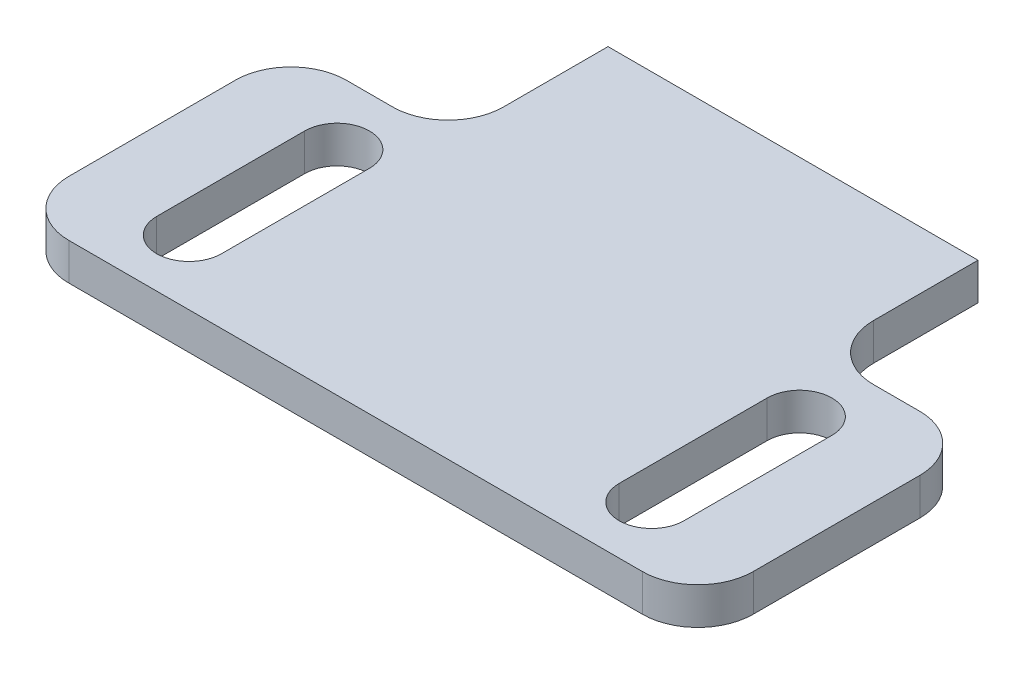
ISO-10303-21;
HEADER;
FILE_DESCRIPTION(('STEP AP214'),'2;1');
FILE_NAME('part.step','',(''),(''),'','','');
FILE_SCHEMA(('AUTOMOTIVE_DESIGN { 1 0 10303 214 1 1 1 1 }'));
ENDSEC;
DATA;
#1=APPLICATION_CONTEXT('core data for automotive mechanical design processes');
#2=APPLICATION_PROTOCOL_DEFINITION('international standard','automotive_design',2000,#1);
#3=PRODUCT_CONTEXT('',#1,'mechanical');
#4=PRODUCT('Part','Part','',(#3));
#5=PRODUCT_RELATED_PRODUCT_CATEGORY('part','',(#4));
#6=PRODUCT_DEFINITION_FORMATION('','',#4);
#7=PRODUCT_DEFINITION_CONTEXT('part definition',#1,'design');
#8=PRODUCT_DEFINITION('design','',#6,#7);
#9=PRODUCT_DEFINITION_SHAPE('','',#8);
#10=(LENGTH_UNIT() NAMED_UNIT(*) SI_UNIT(.MILLI.,.METRE.));
#11=(NAMED_UNIT(*) PLANE_ANGLE_UNIT() SI_UNIT($,.RADIAN.));
#12=(NAMED_UNIT(*) SI_UNIT($,.STERADIAN.) SOLID_ANGLE_UNIT());
#13=UNCERTAINTY_MEASURE_WITH_UNIT(LENGTH_MEASURE(1.E-05),#10,'distance_accuracy_value','');
#14=(GEOMETRIC_REPRESENTATION_CONTEXT(3) GLOBAL_UNCERTAINTY_ASSIGNED_CONTEXT((#13)) GLOBAL_UNIT_ASSIGNED_CONTEXT((#10,
#11,#12)) REPRESENTATION_CONTEXT('',''));
#15=CARTESIAN_POINT('',(0.,0.,0.));
#16=DIRECTION('',(0.,0.,1.));
#17=DIRECTION('',(1.,0.,0.));
#18=AXIS2_PLACEMENT_3D('',#15,#16,#17);
#19=CARTESIAN_POINT('',(10.,-2.,-7.5));
#20=DIRECTION('',(0.,0.,-1.));
#21=DIRECTION('',(-1.,0.,0.));
#22=AXIS2_PLACEMENT_3D('',#19,#20,#21);
#23=PLANE('',#22);
#24=DIRECTION('',(-1.,0.,0.));
#25=VECTOR('',#24,1.);
#26=CARTESIAN_POINT('',(10.,0.,-7.5));
#27=LINE('',#26,#25);
#28=CARTESIAN_POINT('',(15.5,0.,-7.5));
#29=VERTEX_POINT('',#28);
#30=CARTESIAN_POINT('',(13.,0.,-7.5));
#31=VERTEX_POINT('',#30);
#32=EDGE_CURVE('E242',#29,#31,#27,.T.);
#33=ORIENTED_EDGE('',*,*,#32,.F.);
#34=DIRECTION('',(0.,1.,0.));
#35=VECTOR('',#34,1.);
#36=CARTESIAN_POINT('',(15.5,-2.,-7.5));
#37=LINE('',#36,#35);
#38=CARTESIAN_POINT('',(15.5,-2.,-7.5));
#39=VERTEX_POINT('',#38);
#40=EDGE_CURVE('E330',#29,#39,#37,.F.);
#41=ORIENTED_EDGE('',*,*,#40,.T.);
#42=DIRECTION('',(-1.,0.,0.));
#43=VECTOR('',#42,1.);
#44=CARTESIAN_POINT('',(10.,-2.,-7.5));
#45=LINE('',#44,#43);
#46=CARTESIAN_POINT('',(13.,-2.,-7.5));
#47=VERTEX_POINT('',#46);
#48=EDGE_CURVE('E264',#39,#47,#45,.T.);
#49=ORIENTED_EDGE('',*,*,#48,.T.);
#50=DIRECTION('',(0.,1.,0.));
#51=VECTOR('',#50,1.);
#52=CARTESIAN_POINT('',(13.,0.,-7.5));
#53=LINE('',#52,#51);
#54=EDGE_CURVE('E327',#47,#31,#53,.T.);
#55=ORIENTED_EDGE('',*,*,#54,.T.);
#56=EDGE_LOOP('',(#33,#41,#49,#55));
#57=FACE_BOUND('',#56,.T.);
#58=ADVANCED_FACE('F64',(#57),#23,.T.);
#59=CARTESIAN_POINT('',(18.5,-2.,7.5));
#60=DIRECTION('',(1.,0.,0.));
#61=DIRECTION('',(0.,0.,-1.));
#62=AXIS2_PLACEMENT_3D('',#59,#60,#61);
#63=PLANE('',#62);
#64=DIRECTION('',(0.,0.,-1.));
#65=VECTOR('',#64,1.);
#66=CARTESIAN_POINT('',(18.5,-2.,7.5));
#67=LINE('',#66,#65);
#68=CARTESIAN_POINT('',(18.5,-2.,4.5));
#69=VERTEX_POINT('',#68);
#70=CARTESIAN_POINT('',(18.5,-2.,-4.5));
#71=VERTEX_POINT('',#70);
#72=EDGE_CURVE('E285',#69,#71,#67,.T.);
#73=ORIENTED_EDGE('',*,*,#72,.T.);
#74=DIRECTION('',(0.,1.,0.));
#75=VECTOR('',#74,1.);
#76=CARTESIAN_POINT('',(18.5,-2.,-4.5));
#77=LINE('',#76,#75);
#78=CARTESIAN_POINT('',(18.5,0.,-4.5));
#79=VERTEX_POINT('',#78);
#80=EDGE_CURVE('E316',#71,#79,#77,.T.);
#81=ORIENTED_EDGE('',*,*,#80,.T.);
#82=DIRECTION('',(0.,0.,-1.));
#83=VECTOR('',#82,1.);
#84=CARTESIAN_POINT('',(18.5,0.,7.5));
#85=LINE('',#84,#83);
#86=CARTESIAN_POINT('',(18.5,0.,4.5));
#87=VERTEX_POINT('',#86);
#88=EDGE_CURVE('E268',#87,#79,#85,.T.);
#89=ORIENTED_EDGE('',*,*,#88,.F.);
#90=DIRECTION('',(0.,1.,0.));
#91=VECTOR('',#90,1.);
#92=CARTESIAN_POINT('',(18.5,-2.,4.5));
#93=LINE('',#92,#91);
#94=EDGE_CURVE('E312',#87,#69,#93,.F.);
#95=ORIENTED_EDGE('',*,*,#94,.T.);
#96=EDGE_LOOP('',(#73,#81,#89,#95));
#97=FACE_BOUND('',#96,.T.);
#98=ADVANCED_FACE('F400',(#97),#63,.T.);
#99=CARTESIAN_POINT('',(-18.5,-2.,7.5));
#100=DIRECTION('',(0.,0.,1.));
#101=DIRECTION('',(1.,0.,0.));
#102=AXIS2_PLACEMENT_3D('',#99,#100,#101);
#103=PLANE('',#102);
#104=DIRECTION('',(1.,0.,0.));
#105=VECTOR('',#104,1.);
#106=CARTESIAN_POINT('',(-18.5,-2.,7.5));
#107=LINE('',#106,#105);
#108=CARTESIAN_POINT('',(-15.5,-2.,7.5));
#109=VERTEX_POINT('',#108);
#110=CARTESIAN_POINT('',(15.5,-2.,7.5));
#111=VERTEX_POINT('',#110);
#112=EDGE_CURVE('E282',#109,#111,#107,.T.);
#113=ORIENTED_EDGE('',*,*,#112,.T.);
#114=DIRECTION('',(0.,1.,0.));
#115=VECTOR('',#114,1.);
#116=CARTESIAN_POINT('',(15.5,-2.,7.5));
#117=LINE('',#116,#115);
#118=CARTESIAN_POINT('',(15.5,0.,7.5));
#119=VERTEX_POINT('',#118);
#120=EDGE_CURVE('E342',#111,#119,#117,.T.);
#121=ORIENTED_EDGE('',*,*,#120,.T.);
#122=DIRECTION('',(1.,0.,0.));
#123=VECTOR('',#122,1.);
#124=CARTESIAN_POINT('',(-18.5,0.,7.5));
#125=LINE('',#124,#123);
#126=CARTESIAN_POINT('',(-15.5,0.,7.5));
#127=VERTEX_POINT('',#126);
#128=EDGE_CURVE('E305',#127,#119,#125,.T.);
#129=ORIENTED_EDGE('',*,*,#128,.F.);
#130=DIRECTION('',(0.,1.,0.));
#131=VECTOR('',#130,1.);
#132=CARTESIAN_POINT('',(-15.5,-2.,7.5));
#133=LINE('',#132,#131);
#134=EDGE_CURVE('E340',#127,#109,#133,.F.);
#135=ORIENTED_EDGE('',*,*,#134,.T.);
#136=EDGE_LOOP('',(#113,#121,#129,#135));
#137=FACE_BOUND('',#136,.T.);
#138=ADVANCED_FACE('F406',(#137),#103,.T.);
#139=CARTESIAN_POINT('',(-18.5,-2.,7.5));
#140=DIRECTION('',(-1.,0.,0.));
#141=DIRECTION('',(0.,0.,1.));
#142=AXIS2_PLACEMENT_3D('',#139,#140,#141);
#143=PLANE('',#142);
#144=DIRECTION('',(0.,0.,1.));
#145=VECTOR('',#144,1.);
#146=CARTESIAN_POINT('',(-18.5,-2.,7.5));
#147=LINE('',#146,#145);
#148=CARTESIAN_POINT('',(-18.5,-2.,-4.5));
#149=VERTEX_POINT('',#148);
#150=CARTESIAN_POINT('',(-18.5,-2.,4.5));
#151=VERTEX_POINT('',#150);
#152=EDGE_CURVE('E279',#149,#151,#147,.T.);
#153=ORIENTED_EDGE('',*,*,#152,.T.);
#154=DIRECTION('',(0.,1.,0.));
#155=VECTOR('',#154,1.);
#156=CARTESIAN_POINT('',(-18.5,-2.,4.5));
#157=LINE('',#156,#155);
#158=CARTESIAN_POINT('',(-18.5,0.,4.5));
#159=VERTEX_POINT('',#158);
#160=EDGE_CURVE('E347',#151,#159,#157,.T.);
#161=ORIENTED_EDGE('',*,*,#160,.T.);
#162=DIRECTION('',(0.,0.,1.));
#163=VECTOR('',#162,1.);
#164=CARTESIAN_POINT('',(-18.5,0.,7.5));
#165=LINE('',#164,#163);
#166=CARTESIAN_POINT('',(-18.5,0.,-4.5));
#167=VERTEX_POINT('',#166);
#168=EDGE_CURVE('E302',#167,#159,#165,.T.);
#169=ORIENTED_EDGE('',*,*,#168,.F.);
#170=DIRECTION('',(0.,1.,0.));
#171=VECTOR('',#170,1.);
#172=CARTESIAN_POINT('',(-18.5,-2.,-4.5));
#173=LINE('',#172,#171);
#174=EDGE_CURVE('E345',#167,#149,#173,.F.);
#175=ORIENTED_EDGE('',*,*,#174,.T.);
#176=EDGE_LOOP('',(#153,#161,#169,#175));
#177=FACE_BOUND('',#176,.T.);
#178=ADVANCED_FACE('F461',(#177),#143,.T.);
#179=CARTESIAN_POINT('',(-10.,-2.,-7.49999999999999));
#180=DIRECTION('',(0.,0.,-1.));
#181=DIRECTION('',(-1.,0.,0.));
#182=AXIS2_PLACEMENT_3D('',#179,#180,#181);
#183=PLANE('',#182);
#184=DIRECTION('',(-1.,0.,0.));
#185=VECTOR('',#184,1.);
#186=CARTESIAN_POINT('',(-10.,-2.,-7.49999999999999));
#187=LINE('',#186,#185);
#188=CARTESIAN_POINT('',(-13.,-2.,-7.5));
#189=VERTEX_POINT('',#188);
#190=CARTESIAN_POINT('',(-15.5,-2.,-7.5));
#191=VERTEX_POINT('',#190);
#192=EDGE_CURVE('E276',#189,#191,#187,.T.);
#193=ORIENTED_EDGE('',*,*,#192,.T.);
#194=DIRECTION('',(0.,1.,0.));
#195=VECTOR('',#194,1.);
#196=CARTESIAN_POINT('',(-15.5,-2.,-7.5));
#197=LINE('',#196,#195);
#198=CARTESIAN_POINT('',(-15.5,0.,-7.5));
#199=VERTEX_POINT('',#198);
#200=EDGE_CURVE('E352',#191,#199,#197,.T.);
#201=ORIENTED_EDGE('',*,*,#200,.T.);
#202=DIRECTION('',(-1.,0.,0.));
#203=VECTOR('',#202,1.);
#204=CARTESIAN_POINT('',(-10.,0.,-7.49999999999999));
#205=LINE('',#204,#203);
#206=CARTESIAN_POINT('',(-13.,0.,-7.5));
#207=VERTEX_POINT('',#206);
#208=EDGE_CURVE('E299',#207,#199,#205,.T.);
#209=ORIENTED_EDGE('',*,*,#208,.F.);
#210=DIRECTION('',(0.,1.,0.));
#211=VECTOR('',#210,1.);
#212=CARTESIAN_POINT('',(-13.,-2.,-7.5));
#213=LINE('',#212,#211);
#214=EDGE_CURVE('E350',#207,#189,#213,.F.);
#215=ORIENTED_EDGE('',*,*,#214,.T.);
#216=EDGE_LOOP('',(#193,#201,#209,#215));
#217=FACE_BOUND('',#216,.T.);
#218=ADVANCED_FACE('F468',(#217),#183,.T.);
#219=CARTESIAN_POINT('',(-10.,-2.,-16.1460399320007));
#220=DIRECTION('',(-1.,0.,0.));
#221=DIRECTION('',(0.,0.,1.));
#222=AXIS2_PLACEMENT_3D('',#219,#220,#221);
#223=PLANE('',#222);
#224=DIRECTION('',(0.,0.,1.));
#225=VECTOR('',#224,1.);
#226=CARTESIAN_POINT('',(-10.,-2.,-16.1460399320007));
#227=LINE('',#226,#225);
#228=CARTESIAN_POINT('',(-10.,-2.,-16.1460399320007));
#229=VERTEX_POINT('',#228);
#230=CARTESIAN_POINT('',(-10.,-2.,-10.5));
#231=VERTEX_POINT('',#230);
#232=EDGE_CURVE('E273',#229,#231,#227,.T.);
#233=ORIENTED_EDGE('',*,*,#232,.T.);
#234=DIRECTION('',(0.,1.,0.));
#235=VECTOR('',#234,1.);
#236=CARTESIAN_POINT('',(-10.,0.,-10.5));
#237=LINE('',#236,#235);
#238=CARTESIAN_POINT('',(-10.,0.,-10.5));
#239=VERTEX_POINT('',#238);
#240=EDGE_CURVE('E357',#231,#239,#237,.T.);
#241=ORIENTED_EDGE('',*,*,#240,.T.);
#242=DIRECTION('',(0.,0.,1.));
#243=VECTOR('',#242,1.);
#244=CARTESIAN_POINT('',(-10.,0.,-16.1460399320007));
#245=LINE('',#244,#243);
#246=CARTESIAN_POINT('',(-10.,0.,-16.1460399320007));
#247=VERTEX_POINT('',#246);
#248=EDGE_CURVE('E296',#247,#239,#245,.T.);
#249=ORIENTED_EDGE('',*,*,#248,.F.);
#250=DIRECTION('',(0.,1.,0.));
#251=VECTOR('',#250,1.);
#252=CARTESIAN_POINT('',(-10.,-2.,-16.1460399320007));
#253=LINE('',#252,#251);
#254=EDGE_CURVE('E310',#229,#247,#253,.T.);
#255=ORIENTED_EDGE('',*,*,#254,.F.);
#256=EDGE_LOOP('',(#233,#241,#249,#255));
#257=FACE_BOUND('',#256,.T.);
#258=ADVANCED_FACE('F474',(#257),#223,.T.);
#259=CARTESIAN_POINT('',(10.,-2.,-16.1460399320007));
#260=DIRECTION('',(0.,0.,-1.));
#261=DIRECTION('',(-1.,0.,0.));
#262=AXIS2_PLACEMENT_3D('',#259,#260,#261);
#263=PLANE('',#262);
#264=DIRECTION('',(-1.,0.,0.));
#265=VECTOR('',#264,1.);
#266=CARTESIAN_POINT('',(10.,0.,-16.1460399320007));
#267=LINE('',#266,#265);
#268=CARTESIAN_POINT('',(10.,0.,-16.1460399320007));
#269=VERTEX_POINT('',#268);
#270=EDGE_CURVE('E293',#269,#247,#267,.T.);
#271=ORIENTED_EDGE('',*,*,#270,.F.);
#272=DIRECTION('',(0.,1.,0.));
#273=VECTOR('',#272,1.);
#274=CARTESIAN_POINT('',(10.,-2.,-16.1460399320007));
#275=LINE('',#274,#273);
#276=CARTESIAN_POINT('',(10.,-2.,-16.1460399320007));
#277=VERTEX_POINT('',#276);
#278=EDGE_CURVE('E288',#277,#269,#275,.T.);
#279=ORIENTED_EDGE('',*,*,#278,.F.);
#280=DIRECTION('',(-1.,0.,0.));
#281=VECTOR('',#280,1.);
#282=CARTESIAN_POINT('',(10.,-2.,-16.1460399320007));
#283=LINE('',#282,#281);
#284=EDGE_CURVE('E270',#277,#229,#283,.T.);
#285=ORIENTED_EDGE('',*,*,#284,.T.);
#286=ORIENTED_EDGE('',*,*,#254,.T.);
#287=EDGE_LOOP('',(#271,#279,#285,#286));
#288=FACE_BOUND('',#287,.T.);
#289=ADVANCED_FACE('F478',(#288),#263,.T.);
#290=CARTESIAN_POINT('',(10.,-2.,-16.1460399320007));
#291=DIRECTION('',(1.,0.,0.));
#292=DIRECTION('',(0.,0.,-1.));
#293=AXIS2_PLACEMENT_3D('',#290,#291,#292);
#294=PLANE('',#293);
#295=DIRECTION('',(0.,0.,-1.));
#296=VECTOR('',#295,1.);
#297=CARTESIAN_POINT('',(10.,0.,-16.1460399320007));
#298=LINE('',#297,#296);
#299=CARTESIAN_POINT('',(10.,0.,-10.5));
#300=VERTEX_POINT('',#299);
#301=EDGE_CURVE('E291',#300,#269,#298,.T.);
#302=ORIENTED_EDGE('',*,*,#301,.F.);
#303=DIRECTION('',(0.,1.,0.));
#304=VECTOR('',#303,1.);
#305=CARTESIAN_POINT('',(10.,-2.,-10.5));
#306=LINE('',#305,#304);
#307=CARTESIAN_POINT('',(10.,-2.,-10.5));
#308=VERTEX_POINT('',#307);
#309=EDGE_CURVE('E355',#300,#308,#306,.F.);
#310=ORIENTED_EDGE('',*,*,#309,.T.);
#311=DIRECTION('',(0.,0.,-1.));
#312=VECTOR('',#311,1.);
#313=CARTESIAN_POINT('',(10.,-2.,-16.1460399320007));
#314=LINE('',#313,#312);
#315=EDGE_CURVE('E267',#308,#277,#314,.T.);
#316=ORIENTED_EDGE('',*,*,#315,.T.);
#317=ORIENTED_EDGE('',*,*,#278,.T.);
#318=EDGE_LOOP('',(#302,#310,#316,#317));
#319=FACE_BOUND('',#318,.T.);
#320=ADVANCED_FACE('F412',(#319),#294,.T.);
#321=CARTESIAN_POINT('',(0.,-2.,0.));
#322=DIRECTION('',(0.,1.,0.));
#323=DIRECTION('',(0.,0.,1.));
#324=AXIS2_PLACEMENT_3D('',#321,#322,#323);
#325=PLANE('',#324);
#326=DIRECTION('',(0.,0.,-1.));
#327=VECTOR('',#326,1.);
#328=CARTESIAN_POINT('',(-10.75,-2.,0.));
#329=LINE('',#328,#327);
#330=CARTESIAN_POINT('',(-10.75,-2.,4.));
#331=VERTEX_POINT('',#330);
#332=CARTESIAN_POINT('',(-10.75,-2.,-4.));
#333=VERTEX_POINT('',#332);
#334=EDGE_CURVE('E228',#331,#333,#329,.T.);
#335=ORIENTED_EDGE('',*,*,#334,.T.);
#336=CARTESIAN_POINT('',(-12.5,-2.,-4.));
#337=DIRECTION('',(0.,-1.,0.));
#338=DIRECTION('',(0.,0.,-1.));
#339=AXIS2_PLACEMENT_3D('',#336,#337,#338);
#340=CIRCLE('',#339,1.75);
#341=CARTESIAN_POINT('',(-14.25,-2.,-4.));
#342=VERTEX_POINT('',#341);
#343=EDGE_CURVE('E79',#342,#333,#340,.T.);
#344=ORIENTED_EDGE('',*,*,#343,.F.);
#345=DIRECTION('',(0.,0.,-1.));
#346=VECTOR('',#345,1.);
#347=CARTESIAN_POINT('',(-14.25,-2.,0.));
#348=LINE('',#347,#346);
#349=CARTESIAN_POINT('',(-14.25,-2.,4.));
#350=VERTEX_POINT('',#349);
#351=EDGE_CURVE('E236',#350,#342,#348,.T.);
#352=ORIENTED_EDGE('',*,*,#351,.F.);
#353=CARTESIAN_POINT('',(-12.5,-2.,4.));
#354=DIRECTION('',(0.,-1.,0.));
#355=DIRECTION('',(0.,0.,-1.));
#356=AXIS2_PLACEMENT_3D('',#353,#354,#355);
#357=CIRCLE('',#356,1.75);
#358=EDGE_CURVE('E219',#331,#350,#357,.T.);
#359=ORIENTED_EDGE('',*,*,#358,.F.);
#360=EDGE_LOOP('',(#335,#344,#352,#359));
#361=FACE_BOUND('',#360,.T.);
#362=CARTESIAN_POINT('',(12.5,-2.,-4.));
#363=DIRECTION('',(0.,-1.,0.));
#364=DIRECTION('',(0.,0.,-1.));
#365=AXIS2_PLACEMENT_3D('',#362,#363,#364);
#366=CIRCLE('',#365,1.75);
#367=CARTESIAN_POINT('',(10.75,-2.,-4.));
#368=VERTEX_POINT('',#367);
#369=CARTESIAN_POINT('',(14.25,-2.,-4.));
#370=VERTEX_POINT('',#369);
#371=EDGE_CURVE('E260',#368,#370,#366,.T.);
#372=ORIENTED_EDGE('',*,*,#371,.F.);
#373=DIRECTION('',(0.,0.,-1.));
#374=VECTOR('',#373,1.);
#375=CARTESIAN_POINT('',(10.75,-2.,0.));
#376=LINE('',#375,#374);
#377=CARTESIAN_POINT('',(10.75,-2.,4.));
#378=VERTEX_POINT('',#377);
#379=EDGE_CURVE('E87',#378,#368,#376,.T.);
#380=ORIENTED_EDGE('',*,*,#379,.F.);
#381=CARTESIAN_POINT('',(12.5,-2.,4.));
#382=DIRECTION('',(0.,-1.,0.));
#383=DIRECTION('',(0.,0.,-1.));
#384=AXIS2_PLACEMENT_3D('',#381,#382,#383);
#385=CIRCLE('',#384,1.75);
#386=CARTESIAN_POINT('',(14.25,-2.,4.));
#387=VERTEX_POINT('',#386);
#388=EDGE_CURVE('E248',#387,#378,#385,.T.);
#389=ORIENTED_EDGE('',*,*,#388,.F.);
#390=DIRECTION('',(0.,0.,-1.));
#391=VECTOR('',#390,1.);
#392=CARTESIAN_POINT('',(14.25,-2.,0.));
#393=LINE('',#392,#391);
#394=EDGE_CURVE('E257',#387,#370,#393,.T.);
#395=ORIENTED_EDGE('',*,*,#394,.T.);
#396=EDGE_LOOP('',(#372,#380,#389,#395));
#397=FACE_BOUND('',#396,.T.);
#398=ORIENTED_EDGE('',*,*,#48,.F.);
#399=CARTESIAN_POINT('',(15.5,-2.,-4.5));
#400=DIRECTION('',(0.,1.,0.));
#401=DIRECTION('',(0.,0.,1.));
#402=AXIS2_PLACEMENT_3D('',#399,#400,#401);
#403=CIRCLE('',#402,3.);
#404=EDGE_CURVE('E338',#39,#71,#403,.F.);
#405=ORIENTED_EDGE('',*,*,#404,.T.);
#406=ORIENTED_EDGE('',*,*,#72,.F.);
#407=CARTESIAN_POINT('',(15.5,-2.,4.5));
#408=DIRECTION('',(0.,1.,0.));
#409=DIRECTION('',(0.,0.,1.));
#410=AXIS2_PLACEMENT_3D('',#407,#408,#409);
#411=CIRCLE('',#410,3.);
#412=EDGE_CURVE('E336',#69,#111,#411,.F.);
#413=ORIENTED_EDGE('',*,*,#412,.T.);
#414=ORIENTED_EDGE('',*,*,#112,.F.);
#415=CARTESIAN_POINT('',(-15.5,-2.,4.5));
#416=DIRECTION('',(0.,1.,0.));
#417=DIRECTION('',(0.,0.,1.));
#418=AXIS2_PLACEMENT_3D('',#415,#416,#417);
#419=CIRCLE('',#418,3.);
#420=EDGE_CURVE('E334',#109,#151,#419,.F.);
#421=ORIENTED_EDGE('',*,*,#420,.T.);
#422=ORIENTED_EDGE('',*,*,#152,.F.);
#423=CARTESIAN_POINT('',(-15.5,-2.,-4.5));
#424=DIRECTION('',(0.,1.,0.));
#425=DIRECTION('',(0.,0.,1.));
#426=AXIS2_PLACEMENT_3D('',#423,#424,#425);
#427=CIRCLE('',#426,3.);
#428=EDGE_CURVE('E332',#149,#191,#427,.F.);
#429=ORIENTED_EDGE('',*,*,#428,.T.);
#430=ORIENTED_EDGE('',*,*,#192,.F.);
#431=CARTESIAN_POINT('',(-13.,-2.,-10.5));
#432=DIRECTION('',(0.,1.,0.));
#433=DIRECTION('',(0.,0.,1.));
#434=AXIS2_PLACEMENT_3D('',#431,#432,#433);
#435=CIRCLE('',#434,3.);
#436=EDGE_CURVE('E366',#189,#231,#435,.T.);
#437=ORIENTED_EDGE('',*,*,#436,.T.);
#438=ORIENTED_EDGE('',*,*,#232,.F.);
#439=ORIENTED_EDGE('',*,*,#284,.F.);
#440=ORIENTED_EDGE('',*,*,#315,.F.);
#441=CARTESIAN_POINT('',(13.,-2.,-10.5));
#442=DIRECTION('',(0.,1.,0.));
#443=DIRECTION('',(0.,0.,1.));
#444=AXIS2_PLACEMENT_3D('',#441,#442,#443);
#445=CIRCLE('',#444,3.);
#446=EDGE_CURVE('E362',#308,#47,#445,.T.);
#447=ORIENTED_EDGE('',*,*,#446,.T.);
#448=EDGE_LOOP('',(#398,#405,#406,#413,#414,#421,#422,#429,#430,#437,#438,#439,#440,#447));
#449=FACE_BOUND('',#448,.T.);
#450=ADVANCED_FACE('F233',(#361,#397,#449),#325,.F.);
#451=CARTESIAN_POINT('',(0.,0.,0.));
#452=DIRECTION('',(0.,1.,0.));
#453=DIRECTION('',(0.,0.,1.));
#454=AXIS2_PLACEMENT_3D('',#451,#452,#453);
#455=PLANE('',#454);
#456=CARTESIAN_POINT('',(-12.5,0.,-4.));
#457=DIRECTION('',(0.,1.,0.));
#458=DIRECTION('',(0.,0.,1.));
#459=AXIS2_PLACEMENT_3D('',#456,#457,#458);
#460=CIRCLE('',#459,1.75);
#461=CARTESIAN_POINT('',(-10.75,0.,-4.));
#462=VERTEX_POINT('',#461);
#463=CARTESIAN_POINT('',(-14.25,0.,-4.));
#464=VERTEX_POINT('',#463);
#465=EDGE_CURVE('E12',#462,#464,#460,.T.);
#466=ORIENTED_EDGE('',*,*,#465,.F.);
#467=DIRECTION('',(0.,0.,1.));
#468=VECTOR('',#467,1.);
#469=CARTESIAN_POINT('',(-10.75,0.,0.));
#470=LINE('',#469,#468);
#471=CARTESIAN_POINT('',(-10.75,0.,4.));
#472=VERTEX_POINT('',#471);
#473=EDGE_CURVE('E377',#462,#472,#470,.T.);
#474=ORIENTED_EDGE('',*,*,#473,.T.);
#475=CARTESIAN_POINT('',(-12.5,0.,4.));
#476=DIRECTION('',(0.,1.,0.));
#477=DIRECTION('',(0.,0.,1.));
#478=AXIS2_PLACEMENT_3D('',#475,#476,#477);
#479=CIRCLE('',#478,1.75);
#480=CARTESIAN_POINT('',(-14.25,0.,4.));
#481=VERTEX_POINT('',#480);
#482=EDGE_CURVE('E222',#481,#472,#479,.T.);
#483=ORIENTED_EDGE('',*,*,#482,.F.);
#484=DIRECTION('',(0.,0.,1.));
#485=VECTOR('',#484,1.);
#486=CARTESIAN_POINT('',(-14.25,0.,0.));
#487=LINE('',#486,#485);
#488=EDGE_CURVE('E72',#464,#481,#487,.T.);
#489=ORIENTED_EDGE('',*,*,#488,.F.);
#490=EDGE_LOOP('',(#466,#474,#483,#489));
#491=FACE_BOUND('',#490,.T.);
#492=DIRECTION('',(0.,0.,1.));
#493=VECTOR('',#492,1.);
#494=CARTESIAN_POINT('',(10.75,0.,0.));
#495=LINE('',#494,#493);
#496=CARTESIAN_POINT('',(10.75,0.,-4.));
#497=VERTEX_POINT('',#496);
#498=CARTESIAN_POINT('',(10.75,0.,4.));
#499=VERTEX_POINT('',#498);
#500=EDGE_CURVE('E375',#497,#499,#495,.T.);
#501=ORIENTED_EDGE('',*,*,#500,.F.);
#502=CARTESIAN_POINT('',(12.5,0.,-4.));
#503=DIRECTION('',(0.,1.,0.));
#504=DIRECTION('',(0.,0.,1.));
#505=AXIS2_PLACEMENT_3D('',#502,#503,#504);
#506=CIRCLE('',#505,1.75);
#507=CARTESIAN_POINT('',(14.25,0.,-4.));
#508=VERTEX_POINT('',#507);
#509=EDGE_CURVE('E368',#508,#497,#506,.T.);
#510=ORIENTED_EDGE('',*,*,#509,.F.);
#511=DIRECTION('',(0.,0.,1.));
#512=VECTOR('',#511,1.);
#513=CARTESIAN_POINT('',(14.25,0.,0.));
#514=LINE('',#513,#512);
#515=CARTESIAN_POINT('',(14.25,0.,4.));
#516=VERTEX_POINT('',#515);
#517=EDGE_CURVE('E370',#508,#516,#514,.T.);
#518=ORIENTED_EDGE('',*,*,#517,.T.);
#519=CARTESIAN_POINT('',(12.5,0.,4.));
#520=DIRECTION('',(0.,1.,0.));
#521=DIRECTION('',(0.,0.,1.));
#522=AXIS2_PLACEMENT_3D('',#519,#520,#521);
#523=CIRCLE('',#522,1.75);
#524=EDGE_CURVE('E373',#499,#516,#523,.T.);
#525=ORIENTED_EDGE('',*,*,#524,.F.);
#526=EDGE_LOOP('',(#501,#510,#518,#525));
#527=FACE_BOUND('',#526,.T.);
#528=ORIENTED_EDGE('',*,*,#88,.T.);
#529=CARTESIAN_POINT('',(15.5,0.,-4.5));
#530=DIRECTION('',(0.,1.,0.));
#531=DIRECTION('',(0.,0.,1.));
#532=AXIS2_PLACEMENT_3D('',#529,#530,#531);
#533=CIRCLE('',#532,3.);
#534=EDGE_CURVE('E325',#79,#29,#533,.T.);
#535=ORIENTED_EDGE('',*,*,#534,.T.);
#536=ORIENTED_EDGE('',*,*,#32,.T.);
#537=CARTESIAN_POINT('',(13.,0.,-10.5));
#538=DIRECTION('',(0.,1.,0.));
#539=DIRECTION('',(0.,0.,1.));
#540=AXIS2_PLACEMENT_3D('',#537,#538,#539);
#541=CIRCLE('',#540,3.);
#542=EDGE_CURVE('E360',#31,#300,#541,.F.);
#543=ORIENTED_EDGE('',*,*,#542,.T.);
#544=ORIENTED_EDGE('',*,*,#301,.T.);
#545=ORIENTED_EDGE('',*,*,#270,.T.);
#546=ORIENTED_EDGE('',*,*,#248,.T.);
#547=CARTESIAN_POINT('',(-13.,0.,-10.5));
#548=DIRECTION('',(0.,1.,0.));
#549=DIRECTION('',(0.,0.,1.));
#550=AXIS2_PLACEMENT_3D('',#547,#548,#549);
#551=CIRCLE('',#550,3.);
#552=EDGE_CURVE('E364',#239,#207,#551,.F.);
#553=ORIENTED_EDGE('',*,*,#552,.T.);
#554=ORIENTED_EDGE('',*,*,#208,.T.);
#555=CARTESIAN_POINT('',(-15.5,0.,-4.5));
#556=DIRECTION('',(0.,1.,0.));
#557=DIRECTION('',(0.,0.,1.));
#558=AXIS2_PLACEMENT_3D('',#555,#556,#557);
#559=CIRCLE('',#558,3.);
#560=EDGE_CURVE('E319',#199,#167,#559,.T.);
#561=ORIENTED_EDGE('',*,*,#560,.T.);
#562=ORIENTED_EDGE('',*,*,#168,.T.);
#563=CARTESIAN_POINT('',(-15.5,0.,4.5));
#564=DIRECTION('',(0.,1.,0.));
#565=DIRECTION('',(0.,0.,1.));
#566=AXIS2_PLACEMENT_3D('',#563,#564,#565);
#567=CIRCLE('',#566,3.);
#568=EDGE_CURVE('E321',#159,#127,#567,.T.);
#569=ORIENTED_EDGE('',*,*,#568,.T.);
#570=ORIENTED_EDGE('',*,*,#128,.T.);
#571=CARTESIAN_POINT('',(15.5,0.,4.5));
#572=DIRECTION('',(0.,1.,0.));
#573=DIRECTION('',(0.,0.,1.));
#574=AXIS2_PLACEMENT_3D('',#571,#572,#573);
#575=CIRCLE('',#574,3.);
#576=EDGE_CURVE('E323',#119,#87,#575,.T.);
#577=ORIENTED_EDGE('',*,*,#576,.T.);
#578=EDGE_LOOP('',(#528,#535,#536,#543,#544,#545,#546,#553,#554,#561,#562,#569,#570,#577));
#579=FACE_BOUND('',#578,.T.);
#580=ADVANCED_FACE('F385',(#491,#527,#579),#455,.T.);
#581=CARTESIAN_POINT('',(15.5,-2.,-4.5));
#582=DIRECTION('',(0.,1.,0.));
#583=DIRECTION('',(0.,0.,1.));
#584=AXIS2_PLACEMENT_3D('',#581,#582,#583);
#585=CYLINDRICAL_SURFACE('',#584,3.);
#586=ORIENTED_EDGE('',*,*,#404,.F.);
#587=ORIENTED_EDGE('',*,*,#40,.F.);
#588=ORIENTED_EDGE('',*,*,#534,.F.);
#589=ORIENTED_EDGE('',*,*,#80,.F.);
#590=EDGE_LOOP('',(#586,#587,#588,#589));
#591=FACE_BOUND('',#590,.T.);
#592=ADVANCED_FACE('F414',(#591),#585,.T.);
#593=CARTESIAN_POINT('',(15.5,-2.,4.5));
#594=DIRECTION('',(0.,1.,0.));
#595=DIRECTION('',(0.,0.,1.));
#596=AXIS2_PLACEMENT_3D('',#593,#594,#595);
#597=CYLINDRICAL_SURFACE('',#596,3.);
#598=ORIENTED_EDGE('',*,*,#412,.F.);
#599=ORIENTED_EDGE('',*,*,#94,.F.);
#600=ORIENTED_EDGE('',*,*,#576,.F.);
#601=ORIENTED_EDGE('',*,*,#120,.F.);
#602=EDGE_LOOP('',(#598,#599,#600,#601));
#603=FACE_BOUND('',#602,.T.);
#604=ADVANCED_FACE('F417',(#603),#597,.T.);
#605=CARTESIAN_POINT('',(-15.5,-2.,4.5));
#606=DIRECTION('',(0.,1.,0.));
#607=DIRECTION('',(0.,0.,1.));
#608=AXIS2_PLACEMENT_3D('',#605,#606,#607);
#609=CYLINDRICAL_SURFACE('',#608,3.);
#610=ORIENTED_EDGE('',*,*,#420,.F.);
#611=ORIENTED_EDGE('',*,*,#134,.F.);
#612=ORIENTED_EDGE('',*,*,#568,.F.);
#613=ORIENTED_EDGE('',*,*,#160,.F.);
#614=EDGE_LOOP('',(#610,#611,#612,#613));
#615=FACE_BOUND('',#614,.T.);
#616=ADVANCED_FACE('F421',(#615),#609,.T.);
#617=CARTESIAN_POINT('',(-15.5,-2.,-4.5));
#618=DIRECTION('',(0.,1.,0.));
#619=DIRECTION('',(0.,0.,1.));
#620=AXIS2_PLACEMENT_3D('',#617,#618,#619);
#621=CYLINDRICAL_SURFACE('',#620,3.);
#622=ORIENTED_EDGE('',*,*,#428,.F.);
#623=ORIENTED_EDGE('',*,*,#174,.F.);
#624=ORIENTED_EDGE('',*,*,#560,.F.);
#625=ORIENTED_EDGE('',*,*,#200,.F.);
#626=EDGE_LOOP('',(#622,#623,#624,#625));
#627=FACE_BOUND('',#626,.T.);
#628=ADVANCED_FACE('F425',(#627),#621,.T.);
#629=CARTESIAN_POINT('',(13.,-2.,-10.5));
#630=DIRECTION('',(0.,-1.,0.));
#631=DIRECTION('',(0.,0.,-1.));
#632=AXIS2_PLACEMENT_3D('',#629,#630,#631);
#633=CYLINDRICAL_SURFACE('',#632,3.);
#634=ORIENTED_EDGE('',*,*,#446,.F.);
#635=ORIENTED_EDGE('',*,*,#309,.F.);
#636=ORIENTED_EDGE('',*,*,#542,.F.);
#637=ORIENTED_EDGE('',*,*,#54,.F.);
#638=EDGE_LOOP('',(#634,#635,#636,#637));
#639=FACE_BOUND('',#638,.T.);
#640=ADVANCED_FACE('F428',(#639),#633,.F.);
#641=CARTESIAN_POINT('',(-13.,-2.,-10.5));
#642=DIRECTION('',(0.,-1.,0.));
#643=DIRECTION('',(0.,0.,-1.));
#644=AXIS2_PLACEMENT_3D('',#641,#642,#643);
#645=CYLINDRICAL_SURFACE('',#644,3.);
#646=ORIENTED_EDGE('',*,*,#436,.F.);
#647=ORIENTED_EDGE('',*,*,#214,.F.);
#648=ORIENTED_EDGE('',*,*,#552,.F.);
#649=ORIENTED_EDGE('',*,*,#240,.F.);
#650=EDGE_LOOP('',(#646,#647,#648,#649));
#651=FACE_BOUND('',#650,.T.);
#652=ADVANCED_FACE('F66',(#651),#645,.F.);
#653=CARTESIAN_POINT('',(10.75,8.,0.));
#654=DIRECTION('',(-1.,0.,0.));
#655=DIRECTION('',(0.,0.,1.));
#656=AXIS2_PLACEMENT_3D('',#653,#654,#655);
#657=PLANE('',#656);
#658=ORIENTED_EDGE('',*,*,#500,.T.);
#659=DIRECTION('',(0.,-1.,0.));
#660=VECTOR('',#659,1.);
#661=CARTESIAN_POINT('',(10.75,8.,4.));
#662=LINE('',#661,#660);
#663=EDGE_CURVE('E253',#499,#378,#662,.T.);
#664=ORIENTED_EDGE('',*,*,#663,.T.);
#665=ORIENTED_EDGE('',*,*,#379,.T.);
#666=DIRECTION('',(0.,-1.,0.));
#667=VECTOR('',#666,1.);
#668=CARTESIAN_POINT('',(10.75,8.,-4.));
#669=LINE('',#668,#667);
#670=EDGE_CURVE('E246',#497,#368,#669,.T.);
#671=ORIENTED_EDGE('',*,*,#670,.F.);
#672=EDGE_LOOP('',(#658,#664,#665,#671));
#673=FACE_BOUND('',#672,.T.);
#674=ADVANCED_FACE('F435',(#673),#657,.F.);
#675=CARTESIAN_POINT('',(12.5,8.,4.));
#676=DIRECTION('',(0.,-1.,0.));
#677=DIRECTION('',(0.,0.,-1.));
#678=AXIS2_PLACEMENT_3D('',#675,#676,#677);
#679=CYLINDRICAL_SURFACE('',#678,1.75);
#680=ORIENTED_EDGE('',*,*,#524,.T.);
#681=DIRECTION('',(0.,-1.,0.));
#682=VECTOR('',#681,1.);
#683=CARTESIAN_POINT('',(14.25,8.,4.));
#684=LINE('',#683,#682);
#685=EDGE_CURVE('E251',#516,#387,#684,.T.);
#686=ORIENTED_EDGE('',*,*,#685,.T.);
#687=ORIENTED_EDGE('',*,*,#388,.T.);
#688=ORIENTED_EDGE('',*,*,#663,.F.);
#689=EDGE_LOOP('',(#680,#686,#687,#688));
#690=FACE_BOUND('',#689,.T.);
#691=ADVANCED_FACE('F529',(#690),#679,.F.);
#692=CARTESIAN_POINT('',(14.25,8.,0.));
#693=DIRECTION('',(-1.,0.,0.));
#694=DIRECTION('',(0.,0.,1.));
#695=AXIS2_PLACEMENT_3D('',#692,#693,#694);
#696=PLANE('',#695);
#697=DIRECTION('',(0.,-1.,0.));
#698=VECTOR('',#697,1.);
#699=CARTESIAN_POINT('',(14.25,8.,-4.));
#700=LINE('',#699,#698);
#701=EDGE_CURVE('E249',#508,#370,#700,.T.);
#702=ORIENTED_EDGE('',*,*,#701,.T.);
#703=ORIENTED_EDGE('',*,*,#394,.F.);
#704=ORIENTED_EDGE('',*,*,#685,.F.);
#705=ORIENTED_EDGE('',*,*,#517,.F.);
#706=EDGE_LOOP('',(#702,#703,#704,#705));
#707=FACE_BOUND('',#706,.T.);
#708=ADVANCED_FACE('F396',(#707),#696,.T.);
#709=CARTESIAN_POINT('',(12.5,8.,-4.));
#710=DIRECTION('',(0.,-1.,0.));
#711=DIRECTION('',(0.,0.,-1.));
#712=AXIS2_PLACEMENT_3D('',#709,#710,#711);
#713=CYLINDRICAL_SURFACE('',#712,1.75);
#714=ORIENTED_EDGE('',*,*,#509,.T.);
#715=ORIENTED_EDGE('',*,*,#670,.T.);
#716=ORIENTED_EDGE('',*,*,#371,.T.);
#717=ORIENTED_EDGE('',*,*,#701,.F.);
#718=EDGE_LOOP('',(#714,#715,#716,#717));
#719=FACE_BOUND('',#718,.T.);
#720=ADVANCED_FACE('F389',(#719),#713,.F.);
#721=CARTESIAN_POINT('',(-12.5,8.,-4.));
#722=DIRECTION('',(0.,-1.,0.));
#723=DIRECTION('',(0.,0.,-1.));
#724=AXIS2_PLACEMENT_3D('',#721,#722,#723);
#725=CYLINDRICAL_SURFACE('',#724,1.75);
#726=ORIENTED_EDGE('',*,*,#465,.T.);
#727=DIRECTION('',(0.,-1.,0.));
#728=VECTOR('',#727,1.);
#729=CARTESIAN_POINT('',(-14.25,8.,-4.));
#730=LINE('',#729,#728);
#731=EDGE_CURVE('E243',#464,#342,#730,.T.);
#732=ORIENTED_EDGE('',*,*,#731,.T.);
#733=ORIENTED_EDGE('',*,*,#343,.T.);
#734=DIRECTION('',(0.,-1.,0.));
#735=VECTOR('',#734,1.);
#736=CARTESIAN_POINT('',(-10.75,8.,-4.));
#737=LINE('',#736,#735);
#738=EDGE_CURVE('E230',#462,#333,#737,.T.);
#739=ORIENTED_EDGE('',*,*,#738,.F.);
#740=EDGE_LOOP('',(#726,#732,#733,#739));
#741=FACE_BOUND('',#740,.T.);
#742=ADVANCED_FACE('F387',(#741),#725,.F.);
#743=CARTESIAN_POINT('',(-14.25,8.,0.));
#744=DIRECTION('',(-1.,0.,0.));
#745=DIRECTION('',(0.,0.,1.));
#746=AXIS2_PLACEMENT_3D('',#743,#744,#745);
#747=PLANE('',#746);
#748=ORIENTED_EDGE('',*,*,#488,.T.);
#749=DIRECTION('',(0.,-1.,0.));
#750=VECTOR('',#749,1.);
#751=CARTESIAN_POINT('',(-14.25,8.,4.));
#752=LINE('',#751,#750);
#753=EDGE_CURVE('E225',#481,#350,#752,.T.);
#754=ORIENTED_EDGE('',*,*,#753,.T.);
#755=ORIENTED_EDGE('',*,*,#351,.T.);
#756=ORIENTED_EDGE('',*,*,#731,.F.);
#757=EDGE_LOOP('',(#748,#754,#755,#756));
#758=FACE_BOUND('',#757,.T.);
#759=ADVANCED_FACE('F382',(#758),#747,.F.);
#760=CARTESIAN_POINT('',(-12.5,8.,4.));
#761=DIRECTION('',(0.,-1.,0.));
#762=DIRECTION('',(0.,0.,-1.));
#763=AXIS2_PLACEMENT_3D('',#760,#761,#762);
#764=CYLINDRICAL_SURFACE('',#763,1.75);
#765=ORIENTED_EDGE('',*,*,#482,.T.);
#766=DIRECTION('',(0.,-1.,0.));
#767=VECTOR('',#766,1.);
#768=CARTESIAN_POINT('',(-10.75,8.,4.));
#769=LINE('',#768,#767);
#770=EDGE_CURVE('E214',#472,#331,#769,.T.);
#771=ORIENTED_EDGE('',*,*,#770,.T.);
#772=ORIENTED_EDGE('',*,*,#358,.T.);
#773=ORIENTED_EDGE('',*,*,#753,.F.);
#774=EDGE_LOOP('',(#765,#771,#772,#773));
#775=FACE_BOUND('',#774,.T.);
#776=ADVANCED_FACE('F216',(#775),#764,.F.);
#777=CARTESIAN_POINT('',(-10.75,8.,0.));
#778=DIRECTION('',(-1.,0.,0.));
#779=DIRECTION('',(0.,0.,1.));
#780=AXIS2_PLACEMENT_3D('',#777,#778,#779);
#781=PLANE('',#780);
#782=ORIENTED_EDGE('',*,*,#738,.T.);
#783=ORIENTED_EDGE('',*,*,#334,.F.);
#784=ORIENTED_EDGE('',*,*,#770,.F.);
#785=ORIENTED_EDGE('',*,*,#473,.F.);
#786=EDGE_LOOP('',(#782,#783,#784,#785));
#787=FACE_BOUND('',#786,.T.);
#788=ADVANCED_FACE('F229',(#787),#781,.T.);
#789=CLOSED_SHELL('',(#58,#98,#138,#178,#218,#258,#289,#320,#450,#580,#592,#604,#616,#628,#640,
#652,#674,#691,#708,#720,#742,#759,#776,#788));
#790=MANIFOLD_SOLID_BREP('B2',#789);
#791=ADVANCED_BREP_SHAPE_REPRESENTATION('',(#18,#790),#14);
#792=SHAPE_DEFINITION_REPRESENTATION(#9,#791);
ENDSEC;
END-ISO-10303-21;
